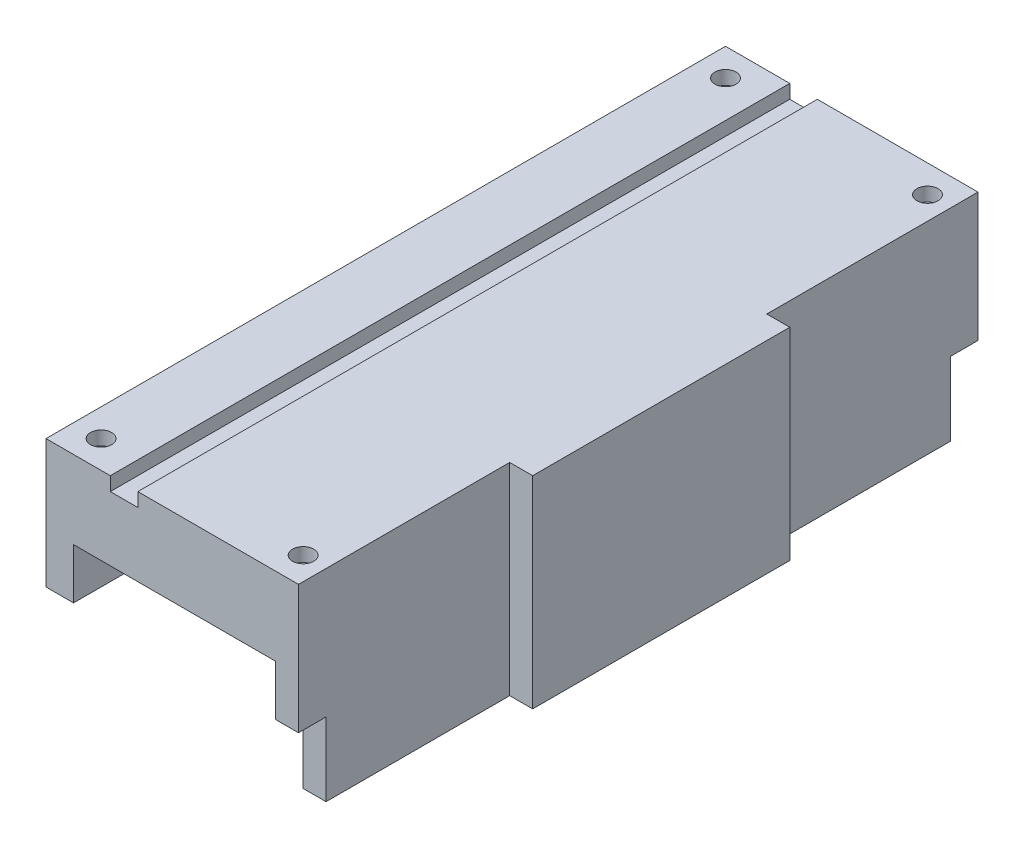
ISO-10303-21;
HEADER;
FILE_DESCRIPTION(('STEP AP214'),'2;1');
FILE_NAME('part.step','',(''),(''),'','','');
FILE_SCHEMA(('AUTOMOTIVE_DESIGN { 1 0 10303 214 1 1 1 1 }'));
ENDSEC;
DATA;
#1=APPLICATION_CONTEXT('core data for automotive mechanical design processes');
#2=APPLICATION_PROTOCOL_DEFINITION('international standard','automotive_design',2000,#1);
#3=PRODUCT_CONTEXT('',#1,'mechanical');
#4=PRODUCT('Part','Part','',(#3));
#5=PRODUCT_RELATED_PRODUCT_CATEGORY('part','',(#4));
#6=PRODUCT_DEFINITION_FORMATION('','',#4);
#7=PRODUCT_DEFINITION_CONTEXT('part definition',#1,'design');
#8=PRODUCT_DEFINITION('design','',#6,#7);
#9=PRODUCT_DEFINITION_SHAPE('','',#8);
#10=(LENGTH_UNIT() NAMED_UNIT(*) SI_UNIT(.MILLI.,.METRE.));
#11=(NAMED_UNIT(*) PLANE_ANGLE_UNIT() SI_UNIT($,.RADIAN.));
#12=(NAMED_UNIT(*) SI_UNIT($,.STERADIAN.) SOLID_ANGLE_UNIT());
#13=UNCERTAINTY_MEASURE_WITH_UNIT(LENGTH_MEASURE(1.E-05),#10,'distance_accuracy_value','');
#14=(GEOMETRIC_REPRESENTATION_CONTEXT(3) GLOBAL_UNCERTAINTY_ASSIGNED_CONTEXT((#13)) GLOBAL_UNIT_ASSIGNED_CONTEXT((#10,
#11,#12)) REPRESENTATION_CONTEXT('',''));
#15=CARTESIAN_POINT('',(0.,0.,0.));
#16=DIRECTION('',(0.,0.,1.));
#17=DIRECTION('',(1.,0.,0.));
#18=AXIS2_PLACEMENT_3D('',#15,#16,#17);
#19=CARTESIAN_POINT('',(0.,22.,0.));
#20=DIRECTION('',(0.,1.,0.));
#21=DIRECTION('',(0.,0.,1.));
#22=AXIS2_PLACEMENT_3D('',#19,#20,#21);
#23=PLANE('',#22);
#24=CARTESIAN_POINT('',(-13.,22.,34.));
#25=DIRECTION('',(0.,1.,0.));
#26=DIRECTION('',(0.,0.,1.));
#27=AXIS2_PLACEMENT_3D('',#24,#25,#26);
#28=CIRCLE('',#27,1.15);
#29=CARTESIAN_POINT('',(-13.,22.,35.15));
#30=VERTEX_POINT('',#29);
#31=EDGE_CURVE('E442',#30,#30,#28,.T.);
#32=ORIENTED_EDGE('',*,*,#31,.F.);
#33=EDGE_LOOP('',(#32));
#34=FACE_BOUND('',#33,.T.);
#35=CARTESIAN_POINT('',(-13.,22.,-34.));
#36=DIRECTION('',(0.,1.,0.));
#37=DIRECTION('',(0.,0.,1.));
#38=AXIS2_PLACEMENT_3D('',#35,#36,#37);
#39=CIRCLE('',#38,1.15);
#40=CARTESIAN_POINT('',(-13.,22.,-32.85));
#41=VERTEX_POINT('',#40);
#42=EDGE_CURVE('E432',#41,#41,#39,.T.);
#43=ORIENTED_EDGE('',*,*,#42,.F.);
#44=EDGE_LOOP('',(#43));
#45=FACE_BOUND('',#44,.T.);
#46=DIRECTION('',(-1.,0.,0.));
#47=VECTOR('',#46,1.);
#48=CARTESIAN_POINT('',(0.,22.,37.));
#49=LINE('',#48,#47);
#50=CARTESIAN_POINT('',(-8.99999999999998,22.,37.));
#51=VERTEX_POINT('',#50);
#52=CARTESIAN_POINT('',(-16.,22.,37.));
#53=VERTEX_POINT('',#52);
#54=EDGE_CURVE('E251',#51,#53,#49,.T.);
#55=ORIENTED_EDGE('',*,*,#54,.F.);
#56=DIRECTION('',(0.,0.,-1.));
#57=VECTOR('',#56,1.);
#58=CARTESIAN_POINT('',(-8.99999999999998,22.,37.));
#59=LINE('',#58,#57);
#60=CARTESIAN_POINT('',(-8.99999999999999,22.,-37.));
#61=VERTEX_POINT('',#60);
#62=EDGE_CURVE('E449',#51,#61,#59,.T.);
#63=ORIENTED_EDGE('',*,*,#62,.T.);
#64=DIRECTION('',(-1.,0.,0.));
#65=VECTOR('',#64,1.);
#66=CARTESIAN_POINT('',(0.,22.,-37.));
#67=LINE('',#66,#65);
#68=CARTESIAN_POINT('',(-16.,22.,-37.));
#69=VERTEX_POINT('',#68);
#70=EDGE_CURVE('E199',#61,#69,#67,.T.);
#71=ORIENTED_EDGE('',*,*,#70,.T.);
#72=DIRECTION('',(0.,0.,1.));
#73=VECTOR('',#72,1.);
#74=CARTESIAN_POINT('',(-16.,22.,0.));
#75=LINE('',#74,#73);
#76=EDGE_CURVE('E248',#69,#53,#75,.T.);
#77=ORIENTED_EDGE('',*,*,#76,.T.);
#78=EDGE_LOOP('',(#55,#63,#71,#77));
#79=FACE_BOUND('',#78,.T.);
#80=ADVANCED_FACE('F34',(#34,#45,#79),#23,.T.);
#81=CARTESIAN_POINT('',(0.,8.,34.));
#82=DIRECTION('',(0.,0.,1.));
#83=DIRECTION('',(1.,0.,0.));
#84=AXIS2_PLACEMENT_3D('',#81,#82,#83);
#85=PLANE('',#84);
#86=DIRECTION('',(1.,0.,0.));
#87=VECTOR('',#86,1.);
#88=CARTESIAN_POINT('',(0.,13.5,34.));
#89=LINE('',#88,#87);
#90=CARTESIAN_POINT('',(-13.,13.5,34.));
#91=VERTEX_POINT('',#90);
#92=CARTESIAN_POINT('',(9.00000000000001,13.5,34.));
#93=VERTEX_POINT('',#92);
#94=EDGE_CURVE('E218',#91,#93,#89,.T.);
#95=ORIENTED_EDGE('',*,*,#94,.F.);
#96=DIRECTION('',(0.,1.,0.));
#97=VECTOR('',#96,1.);
#98=CARTESIAN_POINT('',(-13.,8.,34.));
#99=LINE('',#98,#97);
#100=CARTESIAN_POINT('',(-13.,19.,34.));
#101=VERTEX_POINT('',#100);
#102=EDGE_CURVE('E258',#91,#101,#99,.T.);
#103=ORIENTED_EDGE('',*,*,#102,.T.);
#104=DIRECTION('',(1.,0.,0.));
#105=VECTOR('',#104,1.);
#106=CARTESIAN_POINT('',(-13.,19.,34.));
#107=LINE('',#106,#105);
#108=CARTESIAN_POINT('',(9.00000000000001,19.,34.));
#109=VERTEX_POINT('',#108);
#110=EDGE_CURVE('E273',#101,#109,#107,.T.);
#111=ORIENTED_EDGE('',*,*,#110,.T.);
#112=DIRECTION('',(0.,-1.,0.));
#113=VECTOR('',#112,1.);
#114=CARTESIAN_POINT('',(9.00000000000001,22.,34.));
#115=LINE('',#114,#113);
#116=EDGE_CURVE('E325',#109,#93,#115,.T.);
#117=ORIENTED_EDGE('',*,*,#116,.T.);
#118=EDGE_LOOP('',(#95,#103,#111,#117));
#119=FACE_BOUND('',#118,.T.);
#120=ADVANCED_FACE('F398',(#119),#85,.F.);
#121=CARTESIAN_POINT('',(0.,8.,0.));
#122=DIRECTION('',(0.,1.,0.));
#123=DIRECTION('',(0.,0.,1.));
#124=AXIS2_PLACEMENT_3D('',#121,#122,#123);
#125=PLANE('',#124);
#126=DIRECTION('',(-1.,0.,0.));
#127=VECTOR('',#126,1.);
#128=CARTESIAN_POINT('',(0.,8.,37.));
#129=LINE('',#128,#127);
#130=CARTESIAN_POINT('',(11.5,8.,37.));
#131=VERTEX_POINT('',#130);
#132=CARTESIAN_POINT('',(9.00000000000001,8.,37.));
#133=VERTEX_POINT('',#132);
#134=EDGE_CURVE('E233',#131,#133,#129,.T.);
#135=ORIENTED_EDGE('',*,*,#134,.T.);
#136=DIRECTION('',(0.,0.,-1.));
#137=VECTOR('',#136,1.);
#138=CARTESIAN_POINT('',(9.00000000000001,8.,0.));
#139=LINE('',#138,#137);
#140=CARTESIAN_POINT('',(9.00000000000001,8.,34.));
#141=VERTEX_POINT('',#140);
#142=EDGE_CURVE('E11',#133,#141,#139,.T.);
#143=ORIENTED_EDGE('',*,*,#142,.T.);
#144=DIRECTION('',(1.,0.,0.));
#145=VECTOR('',#144,1.);
#146=CARTESIAN_POINT('',(0.,8.,34.));
#147=LINE('',#146,#145);
#148=CARTESIAN_POINT('',(11.5,8.,34.));
#149=VERTEX_POINT('',#148);
#150=EDGE_CURVE('E236',#141,#149,#147,.T.);
#151=ORIENTED_EDGE('',*,*,#150,.T.);
#152=DIRECTION('',(0.,0.,1.));
#153=VECTOR('',#152,1.);
#154=CARTESIAN_POINT('',(11.5,8.,0.));
#155=LINE('',#154,#153);
#156=EDGE_CURVE('E226',#149,#131,#155,.T.);
#157=ORIENTED_EDGE('',*,*,#156,.T.);
#158=EDGE_LOOP('',(#135,#143,#151,#157));
#159=FACE_BOUND('',#158,.T.);
#160=ADVANCED_FACE('F383',(#159),#125,.F.);
#161=CARTESIAN_POINT('',(0.,22.,-34.));
#162=DIRECTION('',(0.,0.,-1.));
#163=DIRECTION('',(-1.,0.,0.));
#164=AXIS2_PLACEMENT_3D('',#161,#162,#163);
#165=PLANE('',#164);
#166=DIRECTION('',(0.,-1.,0.));
#167=VECTOR('',#166,1.);
#168=CARTESIAN_POINT('',(9.,22.,-34.));
#169=LINE('',#168,#167);
#170=CARTESIAN_POINT('',(9.,8.,-34.));
#171=VERTEX_POINT('',#170);
#172=CARTESIAN_POINT('',(9.,0.,-34.));
#173=VERTEX_POINT('',#172);
#174=EDGE_CURVE('E328',#171,#173,#169,.T.);
#175=ORIENTED_EDGE('',*,*,#174,.F.);
#176=DIRECTION('',(-1.,0.,0.));
#177=VECTOR('',#176,1.);
#178=CARTESIAN_POINT('',(0.,8.,-34.));
#179=LINE('',#178,#177);
#180=CARTESIAN_POINT('',(11.5,8.,-34.));
#181=VERTEX_POINT('',#180);
#182=EDGE_CURVE('E241',#181,#171,#179,.T.);
#183=ORIENTED_EDGE('',*,*,#182,.F.);
#184=DIRECTION('',(0.,-1.,0.));
#185=VECTOR('',#184,1.);
#186=CARTESIAN_POINT('',(11.5,22.,-34.));
#187=LINE('',#186,#185);
#188=CARTESIAN_POINT('',(11.5,0.,-34.));
#189=VERTEX_POINT('',#188);
#190=EDGE_CURVE('E332',#181,#189,#187,.T.);
#191=ORIENTED_EDGE('',*,*,#190,.T.);
#192=DIRECTION('',(1.,0.,0.));
#193=VECTOR('',#192,1.);
#194=CARTESIAN_POINT('',(0.,0.,-34.));
#195=LINE('',#194,#193);
#196=EDGE_CURVE('E305',#173,#189,#195,.T.);
#197=ORIENTED_EDGE('',*,*,#196,.F.);
#198=EDGE_LOOP('',(#175,#183,#191,#197));
#199=FACE_BOUND('',#198,.T.);
#200=ADVANCED_FACE('F365',(#199),#165,.T.);
#201=CARTESIAN_POINT('',(0.,22.,34.));
#202=DIRECTION('',(0.,0.,-1.));
#203=DIRECTION('',(-1.,0.,0.));
#204=AXIS2_PLACEMENT_3D('',#201,#202,#203);
#205=PLANE('',#204);
#206=ORIENTED_EDGE('',*,*,#150,.F.);
#207=CARTESIAN_POINT('',(9.00000000000001,0.,34.));
#208=VERTEX_POINT('',#207);
#209=EDGE_CURVE('E324',#141,#208,#115,.T.);
#210=ORIENTED_EDGE('',*,*,#209,.T.);
#211=DIRECTION('',(1.,0.,0.));
#212=VECTOR('',#211,1.);
#213=CARTESIAN_POINT('',(0.,0.,34.));
#214=LINE('',#213,#212);
#215=CARTESIAN_POINT('',(11.5,0.,34.));
#216=VERTEX_POINT('',#215);
#217=EDGE_CURVE('E311',#208,#216,#214,.T.);
#218=ORIENTED_EDGE('',*,*,#217,.T.);
#219=DIRECTION('',(0.,-1.,0.));
#220=VECTOR('',#219,1.);
#221=CARTESIAN_POINT('',(11.5,22.,34.));
#222=LINE('',#221,#220);
#223=EDGE_CURVE('E322',#149,#216,#222,.T.);
#224=ORIENTED_EDGE('',*,*,#223,.F.);
#225=EDGE_LOOP('',(#206,#210,#218,#224));
#226=FACE_BOUND('',#225,.T.);
#227=ADVANCED_FACE('F385',(#226),#205,.F.);
#228=CARTESIAN_POINT('',(14.,22.,0.));
#229=DIRECTION('',(-1.,0.,0.));
#230=DIRECTION('',(0.,0.,1.));
#231=AXIS2_PLACEMENT_3D('',#228,#229,#230);
#232=PLANE('',#231);
#233=DIRECTION('',(0.,0.,-1.));
#234=VECTOR('',#233,1.);
#235=CARTESIAN_POINT('',(14.,0.,0.));
#236=LINE('',#235,#234);
#237=CARTESIAN_POINT('',(14.,0.,14.));
#238=VERTEX_POINT('',#237);
#239=CARTESIAN_POINT('',(14.,0.,-14.));
#240=VERTEX_POINT('',#239);
#241=EDGE_CURVE('E281',#238,#240,#236,.T.);
#242=ORIENTED_EDGE('',*,*,#241,.T.);
#243=DIRECTION('',(0.,-1.,0.));
#244=VECTOR('',#243,1.);
#245=CARTESIAN_POINT('',(14.,22.,-14.));
#246=LINE('',#245,#244);
#247=CARTESIAN_POINT('',(14.,22.,-14.));
#248=VERTEX_POINT('',#247);
#249=EDGE_CURVE('E42',#248,#240,#246,.T.);
#250=ORIENTED_EDGE('',*,*,#249,.F.);
#251=DIRECTION('',(0.,0.,-1.));
#252=VECTOR('',#251,1.);
#253=CARTESIAN_POINT('',(14.,22.,0.));
#254=LINE('',#253,#252);
#255=CARTESIAN_POINT('',(14.,22.,14.));
#256=VERTEX_POINT('',#255);
#257=EDGE_CURVE('E282',#256,#248,#254,.T.);
#258=ORIENTED_EDGE('',*,*,#257,.F.);
#259=DIRECTION('',(0.,-1.,0.));
#260=VECTOR('',#259,1.);
#261=CARTESIAN_POINT('',(14.,22.,14.));
#262=LINE('',#261,#260);
#263=EDGE_CURVE('E296',#256,#238,#262,.T.);
#264=ORIENTED_EDGE('',*,*,#263,.T.);
#265=EDGE_LOOP('',(#242,#250,#258,#264));
#266=FACE_BOUND('',#265,.T.);
#267=ADVANCED_FACE('F36',(#266),#232,.F.);
#268=CARTESIAN_POINT('',(0.,22.,-14.));
#269=DIRECTION('',(0.,0.,1.));
#270=DIRECTION('',(1.,0.,0.));
#271=AXIS2_PLACEMENT_3D('',#268,#269,#270);
#272=PLANE('',#271);
#273=DIRECTION('',(-1.,0.,0.));
#274=VECTOR('',#273,1.);
#275=CARTESIAN_POINT('',(0.,0.,-14.));
#276=LINE('',#275,#274);
#277=CARTESIAN_POINT('',(11.5,0.,-14.));
#278=VERTEX_POINT('',#277);
#279=EDGE_CURVE('E299',#240,#278,#276,.T.);
#280=ORIENTED_EDGE('',*,*,#279,.T.);
#281=DIRECTION('',(0.,-1.,0.));
#282=VECTOR('',#281,1.);
#283=CARTESIAN_POINT('',(11.5,22.,-14.));
#284=LINE('',#283,#282);
#285=CARTESIAN_POINT('',(11.5,22.,-14.));
#286=VERTEX_POINT('',#285);
#287=EDGE_CURVE('E334',#286,#278,#284,.T.);
#288=ORIENTED_EDGE('',*,*,#287,.F.);
#289=DIRECTION('',(-1.,0.,0.));
#290=VECTOR('',#289,1.);
#291=CARTESIAN_POINT('',(0.,22.,-14.));
#292=LINE('',#291,#290);
#293=EDGE_CURVE('E285',#248,#286,#292,.T.);
#294=ORIENTED_EDGE('',*,*,#293,.F.);
#295=ORIENTED_EDGE('',*,*,#249,.T.);
#296=EDGE_LOOP('',(#280,#288,#294,#295));
#297=FACE_BOUND('',#296,.T.);
#298=ADVANCED_FACE('F338',(#297),#272,.F.);
#299=CARTESIAN_POINT('',(11.5,22.,0.));
#300=DIRECTION('',(1.,0.,0.));
#301=DIRECTION('',(0.,0.,-1.));
#302=AXIS2_PLACEMENT_3D('',#299,#300,#301);
#303=PLANE('',#302);
#304=DIRECTION('',(0.,0.,1.));
#305=VECTOR('',#304,1.);
#306=CARTESIAN_POINT('',(11.5,0.,0.));
#307=LINE('',#306,#305);
#308=EDGE_CURVE('E302',#189,#278,#307,.T.);
#309=ORIENTED_EDGE('',*,*,#308,.F.);
#310=ORIENTED_EDGE('',*,*,#190,.F.);
#311=CARTESIAN_POINT('',(11.5,8.,-37.));
#312=VERTEX_POINT('',#311);
#313=EDGE_CURVE('E221',#312,#181,#155,.T.);
#314=ORIENTED_EDGE('',*,*,#313,.F.);
#315=DIRECTION('',(0.,1.,0.));
#316=VECTOR('',#315,1.);
#317=CARTESIAN_POINT('',(11.5,8.,-37.));
#318=LINE('',#317,#316);
#319=CARTESIAN_POINT('',(11.5,22.,-37.));
#320=VERTEX_POINT('',#319);
#321=EDGE_CURVE('E244',#312,#320,#318,.T.);
#322=ORIENTED_EDGE('',*,*,#321,.T.);
#323=DIRECTION('',(0.,0.,1.));
#324=VECTOR('',#323,1.);
#325=CARTESIAN_POINT('',(11.5,22.,0.));
#326=LINE('',#325,#324);
#327=EDGE_CURVE('E288',#320,#286,#326,.T.);
#328=ORIENTED_EDGE('',*,*,#327,.T.);
#329=ORIENTED_EDGE('',*,*,#287,.T.);
#330=EDGE_LOOP('',(#309,#310,#314,#322,#328,#329));
#331=FACE_BOUND('',#330,.T.);
#332=ADVANCED_FACE('F369',(#331),#303,.T.);
#333=CARTESIAN_POINT('',(9.,22.,0.));
#334=DIRECTION('',(-1.,0.,0.));
#335=DIRECTION('',(0.,0.,1.));
#336=AXIS2_PLACEMENT_3D('',#333,#334,#335);
#337=PLANE('',#336);
#338=DIRECTION('',(0.,0.,1.));
#339=VECTOR('',#338,1.);
#340=CARTESIAN_POINT('',(9.00000000000001,13.5,27.));
#341=LINE('',#340,#339);
#342=CARTESIAN_POINT('',(9.00000000000001,13.5,37.));
#343=VERTEX_POINT('',#342);
#344=EDGE_CURVE('E216',#93,#343,#341,.T.);
#345=ORIENTED_EDGE('',*,*,#344,.F.);
#346=ORIENTED_EDGE('',*,*,#116,.F.);
#347=DIRECTION('',(0.,0.,1.));
#348=VECTOR('',#347,1.);
#349=CARTESIAN_POINT('',(9.,19.,-34.));
#350=LINE('',#349,#348);
#351=CARTESIAN_POINT('',(9.,19.,-34.));
#352=VERTEX_POINT('',#351);
#353=EDGE_CURVE('E257',#352,#109,#350,.T.);
#354=ORIENTED_EDGE('',*,*,#353,.F.);
#355=EDGE_CURVE('E329',#352,#171,#169,.T.);
#356=ORIENTED_EDGE('',*,*,#355,.T.);
#357=ORIENTED_EDGE('',*,*,#174,.T.);
#358=DIRECTION('',(0.,0.,-1.));
#359=VECTOR('',#358,1.);
#360=CARTESIAN_POINT('',(9.,0.,0.));
#361=LINE('',#360,#359);
#362=EDGE_CURVE('E308',#208,#173,#361,.T.);
#363=ORIENTED_EDGE('',*,*,#362,.F.);
#364=ORIENTED_EDGE('',*,*,#209,.F.);
#365=ORIENTED_EDGE('',*,*,#142,.F.);
#366=DIRECTION('',(0.,1.,0.));
#367=VECTOR('',#366,1.);
#368=CARTESIAN_POINT('',(9.00000000000001,0.,37.));
#369=LINE('',#368,#367);
#370=EDGE_CURVE('E212',#133,#343,#369,.T.);
#371=ORIENTED_EDGE('',*,*,#370,.T.);
#372=EDGE_LOOP('',(#345,#346,#354,#356,#357,#363,#364,#365,#371));
#373=FACE_BOUND('',#372,.T.);
#374=ADVANCED_FACE('F360',(#373),#337,.T.);
#375=CARTESIAN_POINT('',(11.5,22.,0.));
#376=DIRECTION('',(1.,0.,0.));
#377=DIRECTION('',(0.,0.,-1.));
#378=AXIS2_PLACEMENT_3D('',#375,#376,#377);
#379=PLANE('',#378);
#380=DIRECTION('',(0.,0.,1.));
#381=VECTOR('',#380,1.);
#382=CARTESIAN_POINT('',(11.5,0.,0.));
#383=LINE('',#382,#381);
#384=CARTESIAN_POINT('',(11.5,0.,14.));
#385=VERTEX_POINT('',#384);
#386=EDGE_CURVE('E314',#385,#216,#383,.T.);
#387=ORIENTED_EDGE('',*,*,#386,.F.);
#388=DIRECTION('',(0.,-1.,0.));
#389=VECTOR('',#388,1.);
#390=CARTESIAN_POINT('',(11.5,22.,14.));
#391=LINE('',#390,#389);
#392=CARTESIAN_POINT('',(11.5,22.,14.));
#393=VERTEX_POINT('',#392);
#394=EDGE_CURVE('E320',#393,#385,#391,.T.);
#395=ORIENTED_EDGE('',*,*,#394,.F.);
#396=DIRECTION('',(0.,0.,1.));
#397=VECTOR('',#396,1.);
#398=CARTESIAN_POINT('',(11.5,22.,0.));
#399=LINE('',#398,#397);
#400=CARTESIAN_POINT('',(11.5,22.,37.));
#401=VERTEX_POINT('',#400);
#402=EDGE_CURVE('E291',#393,#401,#399,.T.);
#403=ORIENTED_EDGE('',*,*,#402,.T.);
#404=DIRECTION('',(0.,1.,0.));
#405=VECTOR('',#404,1.);
#406=CARTESIAN_POINT('',(11.5,8.,37.));
#407=LINE('',#406,#405);
#408=EDGE_CURVE('E260',#131,#401,#407,.T.);
#409=ORIENTED_EDGE('',*,*,#408,.F.);
#410=ORIENTED_EDGE('',*,*,#156,.F.);
#411=ORIENTED_EDGE('',*,*,#223,.T.);
#412=EDGE_LOOP('',(#387,#395,#403,#409,#410,#411));
#413=FACE_BOUND('',#412,.T.);
#414=ADVANCED_FACE('F352',(#413),#379,.T.);
#415=CARTESIAN_POINT('',(0.,22.,14.));
#416=DIRECTION('',(0.,0.,1.));
#417=DIRECTION('',(1.,0.,0.));
#418=AXIS2_PLACEMENT_3D('',#415,#416,#417);
#419=PLANE('',#418);
#420=DIRECTION('',(-1.,0.,0.));
#421=VECTOR('',#420,1.);
#422=CARTESIAN_POINT('',(0.,0.,14.));
#423=LINE('',#422,#421);
#424=EDGE_CURVE('E286',#238,#385,#423,.T.);
#425=ORIENTED_EDGE('',*,*,#424,.F.);
#426=ORIENTED_EDGE('',*,*,#263,.F.);
#427=DIRECTION('',(-1.,0.,0.));
#428=VECTOR('',#427,1.);
#429=CARTESIAN_POINT('',(0.,22.,14.));
#430=LINE('',#429,#428);
#431=EDGE_CURVE('E293',#256,#393,#430,.T.);
#432=ORIENTED_EDGE('',*,*,#431,.T.);
#433=ORIENTED_EDGE('',*,*,#394,.T.);
#434=EDGE_LOOP('',(#425,#426,#432,#433));
#435=FACE_BOUND('',#434,.T.);
#436=ADVANCED_FACE('F347',(#435),#419,.T.);
#437=CARTESIAN_POINT('',(9.00000000000001,22.,34.));
#438=DIRECTION('',(0.,1.,0.));
#439=DIRECTION('',(0.,0.,1.));
#440=AXIS2_PLACEMENT_3D('',#437,#438,#439);
#441=CIRCLE('',#440,1.15);
#442=CARTESIAN_POINT('',(9.00000000000001,22.,35.15));
#443=VERTEX_POINT('',#442);
#444=EDGE_CURVE('E423',#443,#443,#441,.T.);
#445=ORIENTED_EDGE('',*,*,#444,.F.);
#446=EDGE_LOOP('',(#445));
#447=FACE_BOUND('',#446,.T.);
#448=CARTESIAN_POINT('',(9.,22.,-34.));
#449=DIRECTION('',(0.,1.,0.));
#450=DIRECTION('',(0.,0.,1.));
#451=AXIS2_PLACEMENT_3D('',#448,#449,#450);
#452=CIRCLE('',#451,1.15);
#453=CARTESIAN_POINT('',(9.,22.,-32.85));
#454=VERTEX_POINT('',#453);
#455=EDGE_CURVE('E426',#454,#454,#452,.T.);
#456=ORIENTED_EDGE('',*,*,#455,.F.);
#457=EDGE_LOOP('',(#456));
#458=FACE_BOUND('',#457,.T.);
#459=DIRECTION('',(0.,0.,-1.));
#460=VECTOR('',#459,1.);
#461=CARTESIAN_POINT('',(-5.99999999999998,22.,37.));
#462=LINE('',#461,#460);
#463=CARTESIAN_POINT('',(-5.99999999999998,22.,37.));
#464=VERTEX_POINT('',#463);
#465=CARTESIAN_POINT('',(-5.99999999999999,22.,-37.));
#466=VERTEX_POINT('',#465);
#467=EDGE_CURVE('E194',#464,#466,#462,.T.);
#468=ORIENTED_EDGE('',*,*,#467,.F.);
#469=EDGE_CURVE('E225',#401,#464,#49,.T.);
#470=ORIENTED_EDGE('',*,*,#469,.F.);
#471=ORIENTED_EDGE('',*,*,#402,.F.);
#472=ORIENTED_EDGE('',*,*,#431,.F.);
#473=ORIENTED_EDGE('',*,*,#257,.T.);
#474=ORIENTED_EDGE('',*,*,#293,.T.);
#475=ORIENTED_EDGE('',*,*,#327,.F.);
#476=EDGE_CURVE('E245',#320,#466,#67,.T.);
#477=ORIENTED_EDGE('',*,*,#476,.T.);
#478=EDGE_LOOP('',(#468,#470,#471,#472,#473,#474,#475,#477));
#479=FACE_BOUND('',#478,.T.);
#480=ADVANCED_FACE('F374',(#447,#458,#479),#23,.T.);
#481=CARTESIAN_POINT('',(0.,0.,0.));
#482=DIRECTION('',(0.,1.,0.));
#483=DIRECTION('',(0.,0.,1.));
#484=AXIS2_PLACEMENT_3D('',#481,#482,#483);
#485=PLANE('',#484);
#486=ORIENTED_EDGE('',*,*,#241,.F.);
#487=ORIENTED_EDGE('',*,*,#424,.T.);
#488=ORIENTED_EDGE('',*,*,#386,.T.);
#489=ORIENTED_EDGE('',*,*,#217,.F.);
#490=ORIENTED_EDGE('',*,*,#362,.T.);
#491=ORIENTED_EDGE('',*,*,#196,.T.);
#492=ORIENTED_EDGE('',*,*,#308,.T.);
#493=ORIENTED_EDGE('',*,*,#279,.F.);
#494=EDGE_LOOP('',(#486,#487,#488,#489,#490,#491,#492,#493));
#495=FACE_BOUND('',#494,.T.);
#496=ADVANCED_FACE('F345',(#495),#485,.F.);
#497=CARTESIAN_POINT('',(-13.,19.,-34.));
#498=DIRECTION('',(0.,1.,0.));
#499=DIRECTION('',(0.,0.,1.));
#500=AXIS2_PLACEMENT_3D('',#497,#498,#499);
#501=PLANE('',#500);
#502=ORIENTED_EDGE('',*,*,#353,.T.);
#503=ORIENTED_EDGE('',*,*,#110,.F.);
#504=DIRECTION('',(0.,0.,1.));
#505=VECTOR('',#504,1.);
#506=CARTESIAN_POINT('',(-13.,19.,-34.));
#507=LINE('',#506,#505);
#508=CARTESIAN_POINT('',(-13.,19.,-34.));
#509=VERTEX_POINT('',#508);
#510=EDGE_CURVE('E270',#509,#101,#507,.T.);
#511=ORIENTED_EDGE('',*,*,#510,.F.);
#512=DIRECTION('',(1.,0.,0.));
#513=VECTOR('',#512,1.);
#514=CARTESIAN_POINT('',(-13.,19.,-34.));
#515=LINE('',#514,#513);
#516=EDGE_CURVE('E278',#509,#352,#515,.T.);
#517=ORIENTED_EDGE('',*,*,#516,.T.);
#518=EDGE_LOOP('',(#502,#503,#511,#517));
#519=FACE_BOUND('',#518,.T.);
#520=ADVANCED_FACE('F417',(#519),#501,.F.);
#521=CARTESIAN_POINT('',(-13.,8.,0.));
#522=DIRECTION('',(-1.,0.,0.));
#523=DIRECTION('',(0.,0.,1.));
#524=AXIS2_PLACEMENT_3D('',#521,#522,#523);
#525=PLANE('',#524);
#526=ORIENTED_EDGE('',*,*,#102,.F.);
#527=DIRECTION('',(0.,0.,1.));
#528=VECTOR('',#527,1.);
#529=CARTESIAN_POINT('',(-13.,13.5,27.));
#530=LINE('',#529,#528);
#531=CARTESIAN_POINT('',(-13.,13.5,37.));
#532=VERTEX_POINT('',#531);
#533=EDGE_CURVE('E215',#91,#532,#530,.T.);
#534=ORIENTED_EDGE('',*,*,#533,.T.);
#535=DIRECTION('',(0.,-1.,0.));
#536=VECTOR('',#535,1.);
#537=CARTESIAN_POINT('',(-13.,0.,37.));
#538=LINE('',#537,#536);
#539=CARTESIAN_POINT('',(-13.,8.,37.));
#540=VERTEX_POINT('',#539);
#541=EDGE_CURVE('E209',#532,#540,#538,.T.);
#542=ORIENTED_EDGE('',*,*,#541,.T.);
#543=DIRECTION('',(0.,0.,1.));
#544=VECTOR('',#543,1.);
#545=CARTESIAN_POINT('',(-13.,8.,0.));
#546=LINE('',#545,#544);
#547=CARTESIAN_POINT('',(-13.,8.,-34.));
#548=VERTEX_POINT('',#547);
#549=EDGE_CURVE('E57',#548,#540,#546,.T.);
#550=ORIENTED_EDGE('',*,*,#549,.F.);
#551=DIRECTION('',(0.,1.,0.));
#552=VECTOR('',#551,1.);
#553=CARTESIAN_POINT('',(-13.,8.,-34.));
#554=LINE('',#553,#552);
#555=EDGE_CURVE('E254',#548,#509,#554,.T.);
#556=ORIENTED_EDGE('',*,*,#555,.T.);
#557=ORIENTED_EDGE('',*,*,#510,.T.);
#558=EDGE_LOOP('',(#526,#534,#542,#550,#556,#557));
#559=FACE_BOUND('',#558,.T.);
#560=ADVANCED_FACE('F471',(#559),#525,.F.);
#561=CARTESIAN_POINT('',(0.,8.,-34.));
#562=DIRECTION('',(0.,0.,-1.));
#563=DIRECTION('',(-1.,0.,0.));
#564=AXIS2_PLACEMENT_3D('',#561,#562,#563);
#565=PLANE('',#564);
#566=ORIENTED_EDGE('',*,*,#355,.F.);
#567=ORIENTED_EDGE('',*,*,#516,.F.);
#568=ORIENTED_EDGE('',*,*,#555,.F.);
#569=EDGE_CURVE('E240',#171,#548,#179,.T.);
#570=ORIENTED_EDGE('',*,*,#569,.F.);
#571=EDGE_LOOP('',(#566,#567,#568,#570));
#572=FACE_BOUND('',#571,.T.);
#573=ADVANCED_FACE('F468',(#572),#565,.F.);
#574=CARTESIAN_POINT('',(0.,8.,37.));
#575=DIRECTION('',(0.,0.,-1.));
#576=DIRECTION('',(-1.,0.,0.));
#577=AXIS2_PLACEMENT_3D('',#574,#575,#576);
#578=PLANE('',#577);
#579=ORIENTED_EDGE('',*,*,#469,.T.);
#580=DIRECTION('',(0.,1.,0.));
#581=VECTOR('',#580,1.);
#582=CARTESIAN_POINT('',(-5.99999999999998,20.5,37.));
#583=LINE('',#582,#581);
#584=CARTESIAN_POINT('',(-5.99999999999998,20.5,37.));
#585=VERTEX_POINT('',#584);
#586=EDGE_CURVE('E201',#585,#464,#583,.T.);
#587=ORIENTED_EDGE('',*,*,#586,.F.);
#588=DIRECTION('',(-1.,0.,0.));
#589=VECTOR('',#588,1.);
#590=CARTESIAN_POINT('',(-5.99999999999998,20.5,37.));
#591=LINE('',#590,#589);
#592=CARTESIAN_POINT('',(-8.99999999999998,20.5,37.));
#593=VERTEX_POINT('',#592);
#594=EDGE_CURVE('E187',#585,#593,#591,.T.);
#595=ORIENTED_EDGE('',*,*,#594,.T.);
#596=DIRECTION('',(0.,1.,0.));
#597=VECTOR('',#596,1.);
#598=CARTESIAN_POINT('',(-8.99999999999998,20.5,37.));
#599=LINE('',#598,#597);
#600=EDGE_CURVE('E185',#593,#51,#599,.T.);
#601=ORIENTED_EDGE('',*,*,#600,.T.);
#602=ORIENTED_EDGE('',*,*,#54,.T.);
#603=DIRECTION('',(0.,1.,0.));
#604=VECTOR('',#603,1.);
#605=CARTESIAN_POINT('',(-16.,8.,37.));
#606=LINE('',#605,#604);
#607=CARTESIAN_POINT('',(-16.,8.,37.));
#608=VERTEX_POINT('',#607);
#609=EDGE_CURVE('E263',#608,#53,#606,.T.);
#610=ORIENTED_EDGE('',*,*,#609,.F.);
#611=EDGE_CURVE('E232',#540,#608,#129,.T.);
#612=ORIENTED_EDGE('',*,*,#611,.F.);
#613=ORIENTED_EDGE('',*,*,#541,.F.);
#614=DIRECTION('',(1.,0.,0.));
#615=VECTOR('',#614,1.);
#616=CARTESIAN_POINT('',(0.,13.5,37.));
#617=LINE('',#616,#615);
#618=EDGE_CURVE('E206',#532,#343,#617,.T.);
#619=ORIENTED_EDGE('',*,*,#618,.T.);
#620=ORIENTED_EDGE('',*,*,#370,.F.);
#621=ORIENTED_EDGE('',*,*,#134,.F.);
#622=ORIENTED_EDGE('',*,*,#408,.T.);
#623=EDGE_LOOP('',(#579,#587,#595,#601,#602,#610,#612,#613,#619,#620,#621,#622));
#624=FACE_BOUND('',#623,.T.);
#625=ADVANCED_FACE('F379',(#624),#578,.F.);
#626=CARTESIAN_POINT('',(-16.,8.,0.));
#627=DIRECTION('',(-1.,0.,0.));
#628=DIRECTION('',(0.,0.,1.));
#629=AXIS2_PLACEMENT_3D('',#626,#627,#628);
#630=PLANE('',#629);
#631=ORIENTED_EDGE('',*,*,#76,.F.);
#632=DIRECTION('',(0.,1.,0.));
#633=VECTOR('',#632,1.);
#634=CARTESIAN_POINT('',(-16.,8.,-37.));
#635=LINE('',#634,#633);
#636=CARTESIAN_POINT('',(-16.,8.,-37.));
#637=VERTEX_POINT('',#636);
#638=EDGE_CURVE('E266',#637,#69,#635,.T.);
#639=ORIENTED_EDGE('',*,*,#638,.F.);
#640=DIRECTION('',(0.,0.,1.));
#641=VECTOR('',#640,1.);
#642=CARTESIAN_POINT('',(-16.,8.,0.));
#643=LINE('',#642,#641);
#644=EDGE_CURVE('E229',#637,#608,#643,.T.);
#645=ORIENTED_EDGE('',*,*,#644,.T.);
#646=ORIENTED_EDGE('',*,*,#609,.T.);
#647=EDGE_LOOP('',(#631,#639,#645,#646));
#648=FACE_BOUND('',#647,.T.);
#649=ADVANCED_FACE('F459',(#648),#630,.T.);
#650=CARTESIAN_POINT('',(0.,8.,-37.));
#651=DIRECTION('',(0.,0.,-1.));
#652=DIRECTION('',(-1.,0.,0.));
#653=AXIS2_PLACEMENT_3D('',#650,#651,#652);
#654=PLANE('',#653);
#655=DIRECTION('',(0.,1.,0.));
#656=VECTOR('',#655,1.);
#657=CARTESIAN_POINT('',(-5.99999999999999,20.5,-37.));
#658=LINE('',#657,#656);
#659=CARTESIAN_POINT('',(-5.99999999999998,20.5,-37.));
#660=VERTEX_POINT('',#659);
#661=EDGE_CURVE('E210',#660,#466,#658,.T.);
#662=ORIENTED_EDGE('',*,*,#661,.T.);
#663=ORIENTED_EDGE('',*,*,#476,.F.);
#664=ORIENTED_EDGE('',*,*,#321,.F.);
#665=DIRECTION('',(-1.,0.,0.));
#666=VECTOR('',#665,1.);
#667=CARTESIAN_POINT('',(0.,8.,-37.));
#668=LINE('',#667,#666);
#669=EDGE_CURVE('E224',#312,#637,#668,.T.);
#670=ORIENTED_EDGE('',*,*,#669,.T.);
#671=ORIENTED_EDGE('',*,*,#638,.T.);
#672=ORIENTED_EDGE('',*,*,#70,.F.);
#673=DIRECTION('',(0.,1.,0.));
#674=VECTOR('',#673,1.);
#675=CARTESIAN_POINT('',(-8.99999999999999,20.5,-37.));
#676=LINE('',#675,#674);
#677=CARTESIAN_POINT('',(-8.99999999999999,20.5,-37.));
#678=VERTEX_POINT('',#677);
#679=EDGE_CURVE('E182',#678,#61,#676,.T.);
#680=ORIENTED_EDGE('',*,*,#679,.F.);
#681=DIRECTION('',(-1.,0.,0.));
#682=VECTOR('',#681,1.);
#683=CARTESIAN_POINT('',(-5.99999999999999,20.5,-37.));
#684=LINE('',#683,#682);
#685=EDGE_CURVE('E188',#660,#678,#684,.T.);
#686=ORIENTED_EDGE('',*,*,#685,.F.);
#687=EDGE_LOOP('',(#662,#663,#664,#670,#671,#672,#680,#686));
#688=FACE_BOUND('',#687,.T.);
#689=ADVANCED_FACE('F197',(#688),#654,.T.);
#690=ORIENTED_EDGE('',*,*,#549,.T.);
#691=ORIENTED_EDGE('',*,*,#611,.T.);
#692=ORIENTED_EDGE('',*,*,#644,.F.);
#693=ORIENTED_EDGE('',*,*,#669,.F.);
#694=ORIENTED_EDGE('',*,*,#313,.T.);
#695=ORIENTED_EDGE('',*,*,#182,.T.);
#696=ORIENTED_EDGE('',*,*,#569,.T.);
#697=EDGE_LOOP('',(#690,#691,#692,#693,#694,#695,#696));
#698=FACE_BOUND('',#697,.T.);
#699=ADVANCED_FACE('F463',(#698),#125,.F.);
#700=CARTESIAN_POINT('',(0.,13.5,27.));
#701=DIRECTION('',(0.,-1.,0.));
#702=DIRECTION('',(0.,0.,-1.));
#703=AXIS2_PLACEMENT_3D('',#700,#701,#702);
#704=PLANE('',#703);
#705=ORIENTED_EDGE('',*,*,#94,.T.);
#706=ORIENTED_EDGE('',*,*,#344,.T.);
#707=ORIENTED_EDGE('',*,*,#618,.F.);
#708=ORIENTED_EDGE('',*,*,#533,.F.);
#709=EDGE_LOOP('',(#705,#706,#707,#708));
#710=FACE_BOUND('',#709,.T.);
#711=ADVANCED_FACE('F475',(#710),#704,.T.);
#712=CARTESIAN_POINT('',(-5.99999999999998,20.5,37.));
#713=DIRECTION('',(1.,0.,0.));
#714=DIRECTION('',(0.,0.,-1.));
#715=AXIS2_PLACEMENT_3D('',#712,#713,#714);
#716=PLANE('',#715);
#717=ORIENTED_EDGE('',*,*,#467,.T.);
#718=ORIENTED_EDGE('',*,*,#661,.F.);
#719=DIRECTION('',(0.,0.,-1.));
#720=VECTOR('',#719,1.);
#721=CARTESIAN_POINT('',(-5.99999999999998,20.5,37.));
#722=LINE('',#721,#720);
#723=EDGE_CURVE('E49',#585,#660,#722,.T.);
#724=ORIENTED_EDGE('',*,*,#723,.F.);
#725=ORIENTED_EDGE('',*,*,#586,.T.);
#726=EDGE_LOOP('',(#717,#718,#724,#725));
#727=FACE_BOUND('',#726,.T.);
#728=ADVANCED_FACE('F453',(#727),#716,.F.);
#729=CARTESIAN_POINT('',(-8.99999999999998,20.5,37.));
#730=DIRECTION('',(1.,0.,0.));
#731=DIRECTION('',(0.,0.,-1.));
#732=AXIS2_PLACEMENT_3D('',#729,#730,#731);
#733=PLANE('',#732);
#734=ORIENTED_EDGE('',*,*,#62,.F.);
#735=ORIENTED_EDGE('',*,*,#600,.F.);
#736=DIRECTION('',(0.,0.,-1.));
#737=VECTOR('',#736,1.);
#738=CARTESIAN_POINT('',(-8.99999999999998,20.5,37.));
#739=LINE('',#738,#737);
#740=EDGE_CURVE('E179',#593,#678,#739,.T.);
#741=ORIENTED_EDGE('',*,*,#740,.T.);
#742=ORIENTED_EDGE('',*,*,#679,.T.);
#743=EDGE_LOOP('',(#734,#735,#741,#742));
#744=FACE_BOUND('',#743,.T.);
#745=ADVANCED_FACE('F180',(#744),#733,.T.);
#746=CARTESIAN_POINT('',(0.,20.5,0.));
#747=DIRECTION('',(0.,-1.,0.));
#748=DIRECTION('',(0.,0.,-1.));
#749=AXIS2_PLACEMENT_3D('',#746,#747,#748);
#750=PLANE('',#749);
#751=ORIENTED_EDGE('',*,*,#685,.T.);
#752=ORIENTED_EDGE('',*,*,#740,.F.);
#753=ORIENTED_EDGE('',*,*,#594,.F.);
#754=ORIENTED_EDGE('',*,*,#723,.T.);
#755=EDGE_LOOP('',(#751,#752,#753,#754));
#756=FACE_BOUND('',#755,.T.);
#757=ADVANCED_FACE('F191',(#756),#750,.F.);
#758=CARTESIAN_POINT('',(-13.,20.5,-34.));
#759=DIRECTION('',(0.,1.,0.));
#760=DIRECTION('',(0.,0.,1.));
#761=AXIS2_PLACEMENT_3D('',#758,#759,#760);
#762=CYLINDRICAL_SURFACE('',#761,1.15);
#763=CARTESIAN_POINT('',(-13.,20.5,-34.));
#764=DIRECTION('',(0.,1.,0.));
#765=DIRECTION('',(0.,0.,1.));
#766=AXIS2_PLACEMENT_3D('',#763,#764,#765);
#767=CIRCLE('',#766,1.15);
#768=CARTESIAN_POINT('',(-13.,20.5,-32.85));
#769=VERTEX_POINT('',#768);
#770=EDGE_CURVE('E428',#769,#769,#767,.T.);
#771=ORIENTED_EDGE('',*,*,#770,.F.);
#772=EDGE_LOOP('',(#771));
#773=FACE_BOUND('',#772,.T.);
#774=ORIENTED_EDGE('',*,*,#42,.T.);
#775=EDGE_LOOP('',(#774));
#776=FACE_BOUND('',#775,.T.);
#777=ADVANCED_FACE('F503',(#773,#776),#762,.F.);
#778=CARTESIAN_POINT('',(-13.,20.5,-34.));
#779=DIRECTION('',(0.,1.,0.));
#780=DIRECTION('',(0.,0.,1.));
#781=AXIS2_PLACEMENT_3D('',#778,#779,#780);
#782=PLANE('',#781);
#783=ORIENTED_EDGE('',*,*,#770,.T.);
#784=EDGE_LOOP('',(#783));
#785=FACE_BOUND('',#784,.T.);
#786=ADVANCED_FACE('F527',(#785),#782,.T.);
#787=CARTESIAN_POINT('',(9.,20.5,-34.));
#788=DIRECTION('',(0.,1.,0.));
#789=DIRECTION('',(0.,0.,1.));
#790=AXIS2_PLACEMENT_3D('',#787,#788,#789);
#791=CYLINDRICAL_SURFACE('',#790,1.15);
#792=CARTESIAN_POINT('',(9.,20.5,-34.));
#793=DIRECTION('',(0.,1.,0.));
#794=DIRECTION('',(0.,0.,1.));
#795=AXIS2_PLACEMENT_3D('',#792,#793,#794);
#796=CIRCLE('',#795,1.15);
#797=CARTESIAN_POINT('',(9.,20.5,-32.85));
#798=VERTEX_POINT('',#797);
#799=EDGE_CURVE('E429',#798,#798,#796,.T.);
#800=ORIENTED_EDGE('',*,*,#799,.F.);
#801=EDGE_LOOP('',(#800));
#802=FACE_BOUND('',#801,.T.);
#803=ORIENTED_EDGE('',*,*,#455,.T.);
#804=EDGE_LOOP('',(#803));
#805=FACE_BOUND('',#804,.T.);
#806=ADVANCED_FACE('F523',(#802,#805),#791,.F.);
#807=CARTESIAN_POINT('',(9.,20.5,-34.));
#808=DIRECTION('',(0.,1.,0.));
#809=DIRECTION('',(0.,0.,1.));
#810=AXIS2_PLACEMENT_3D('',#807,#808,#809);
#811=PLANE('',#810);
#812=ORIENTED_EDGE('',*,*,#799,.T.);
#813=EDGE_LOOP('',(#812));
#814=FACE_BOUND('',#813,.T.);
#815=ADVANCED_FACE('F519',(#814),#811,.T.);
#816=CARTESIAN_POINT('',(9.00000000000001,20.5,34.));
#817=DIRECTION('',(0.,1.,0.));
#818=DIRECTION('',(0.,0.,1.));
#819=AXIS2_PLACEMENT_3D('',#816,#817,#818);
#820=CYLINDRICAL_SURFACE('',#819,1.15);
#821=CARTESIAN_POINT('',(9.00000000000001,20.5,34.));
#822=DIRECTION('',(0.,1.,0.));
#823=DIRECTION('',(0.,0.,1.));
#824=AXIS2_PLACEMENT_3D('',#821,#822,#823);
#825=CIRCLE('',#824,1.15);
#826=CARTESIAN_POINT('',(9.00000000000001,20.5,35.15));
#827=VERTEX_POINT('',#826);
#828=EDGE_CURVE('E439',#827,#827,#825,.T.);
#829=ORIENTED_EDGE('',*,*,#828,.F.);
#830=EDGE_LOOP('',(#829));
#831=FACE_BOUND('',#830,.T.);
#832=ORIENTED_EDGE('',*,*,#444,.T.);
#833=EDGE_LOOP('',(#832));
#834=FACE_BOUND('',#833,.T.);
#835=ADVANCED_FACE('F515',(#831,#834),#820,.F.);
#836=CARTESIAN_POINT('',(9.00000000000001,20.5,34.));
#837=DIRECTION('',(0.,1.,0.));
#838=DIRECTION('',(0.,0.,1.));
#839=AXIS2_PLACEMENT_3D('',#836,#837,#838);
#840=PLANE('',#839);
#841=ORIENTED_EDGE('',*,*,#828,.T.);
#842=EDGE_LOOP('',(#841));
#843=FACE_BOUND('',#842,.T.);
#844=ADVANCED_FACE('F511',(#843),#840,.T.);
#845=CARTESIAN_POINT('',(-13.,20.5,34.));
#846=DIRECTION('',(0.,1.,0.));
#847=DIRECTION('',(0.,0.,1.));
#848=AXIS2_PLACEMENT_3D('',#845,#846,#847);
#849=CYLINDRICAL_SURFACE('',#848,1.15);
#850=CARTESIAN_POINT('',(-13.,20.5,34.));
#851=DIRECTION('',(0.,1.,0.));
#852=DIRECTION('',(0.,0.,1.));
#853=AXIS2_PLACEMENT_3D('',#850,#851,#852);
#854=CIRCLE('',#853,1.15);
#855=CARTESIAN_POINT('',(-13.,20.5,35.15));
#856=VERTEX_POINT('',#855);
#857=EDGE_CURVE('E445',#856,#856,#854,.T.);
#858=ORIENTED_EDGE('',*,*,#857,.F.);
#859=EDGE_LOOP('',(#858));
#860=FACE_BOUND('',#859,.T.);
#861=ORIENTED_EDGE('',*,*,#31,.T.);
#862=EDGE_LOOP('',(#861));
#863=FACE_BOUND('',#862,.T.);
#864=ADVANCED_FACE('F507',(#860,#863),#849,.F.);
#865=CARTESIAN_POINT('',(-13.,20.5,34.));
#866=DIRECTION('',(0.,1.,0.));
#867=DIRECTION('',(0.,0.,1.));
#868=AXIS2_PLACEMENT_3D('',#865,#866,#867);
#869=PLANE('',#868);
#870=ORIENTED_EDGE('',*,*,#857,.T.);
#871=EDGE_LOOP('',(#870));
#872=FACE_BOUND('',#871,.T.);
#873=ADVANCED_FACE('F504',(#872),#869,.T.);
#874=CLOSED_SHELL('',(#80,#120,#160,#200,#227,#267,#298,#332,#374,#414,#436,#480,#496,#520,#560,
#573,#625,#649,#689,#699,#711,#728,#745,#757,#777,#786,#806,#815,#835,#844,#864,#873));
#875=MANIFOLD_SOLID_BREP('B2',#874);
#876=ADVANCED_BREP_SHAPE_REPRESENTATION('',(#18,#875),#14);
#877=SHAPE_DEFINITION_REPRESENTATION(#9,#876);
ENDSEC;
END-ISO-10303-21;
